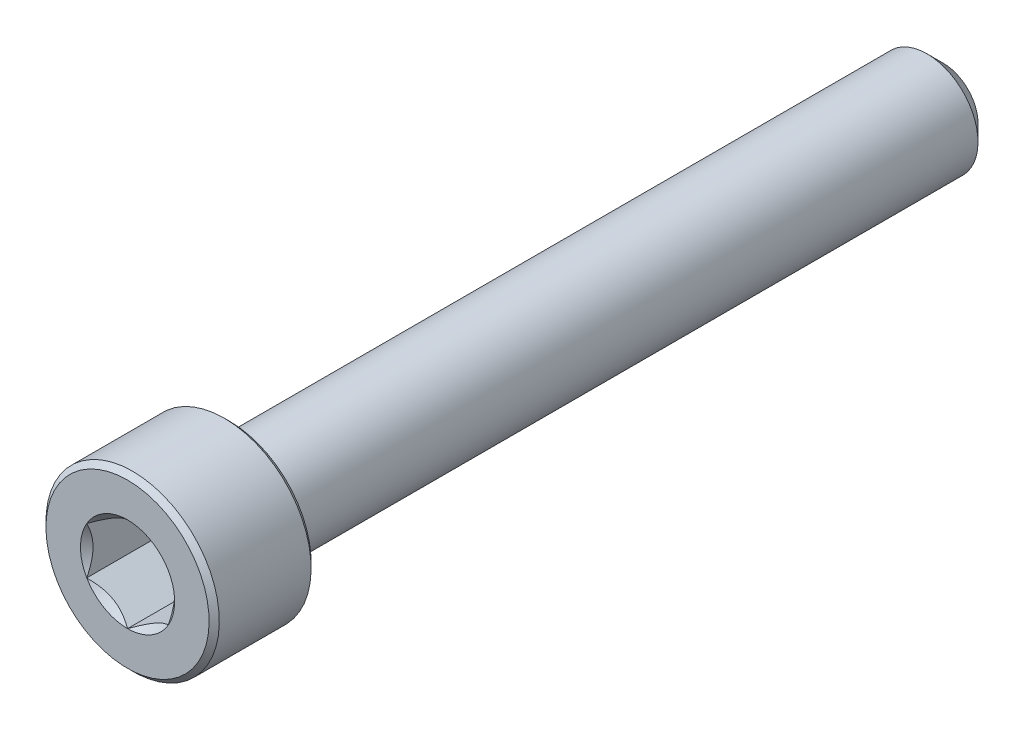
ISO-10303-21;
HEADER;
FILE_DESCRIPTION(('STEP AP214'),'2;1');
FILE_NAME('part.step','',(''),(''),'','','');
FILE_SCHEMA(('AUTOMOTIVE_DESIGN { 1 0 10303 214 1 1 1 1 }'));
ENDSEC;
DATA;
#1=APPLICATION_CONTEXT('core data for automotive mechanical design processes');
#2=APPLICATION_PROTOCOL_DEFINITION('international standard','automotive_design',2000,#1);
#3=PRODUCT_CONTEXT('',#1,'mechanical');
#4=PRODUCT('Part','Part','',(#3));
#5=PRODUCT_RELATED_PRODUCT_CATEGORY('part','',(#4));
#6=PRODUCT_DEFINITION_FORMATION('','',#4);
#7=PRODUCT_DEFINITION_CONTEXT('part definition',#1,'design');
#8=PRODUCT_DEFINITION('design','',#6,#7);
#9=PRODUCT_DEFINITION_SHAPE('','',#8);
#10=(LENGTH_UNIT() NAMED_UNIT(*) SI_UNIT(.MILLI.,.METRE.));
#11=(NAMED_UNIT(*) PLANE_ANGLE_UNIT() SI_UNIT($,.RADIAN.));
#12=(NAMED_UNIT(*) SI_UNIT($,.STERADIAN.) SOLID_ANGLE_UNIT());
#13=UNCERTAINTY_MEASURE_WITH_UNIT(LENGTH_MEASURE(1.E-05),#10,'distance_accuracy_value','');
#14=(GEOMETRIC_REPRESENTATION_CONTEXT(3) GLOBAL_UNCERTAINTY_ASSIGNED_CONTEXT((#13)) GLOBAL_UNIT_ASSIGNED_CONTEXT((#10,
#11,#12)) REPRESENTATION_CONTEXT('',''));
#15=CARTESIAN_POINT('',(0.,0.,0.));
#16=DIRECTION('',(0.,0.,1.));
#17=DIRECTION('',(1.,0.,0.));
#18=AXIS2_PLACEMENT_3D('',#15,#16,#17);
#19=CARTESIAN_POINT('',(0.,0.,20.));
#20=DIRECTION('',(0.,0.,1.));
#21=DIRECTION('',(0.,-1.,0.));
#22=AXIS2_PLACEMENT_3D('',#19,#20,#21);
#23=PLANE('',#22);
#24=CARTESIAN_POINT('',(0.,0.,20.));
#25=DIRECTION('',(0.,0.,1.));
#26=DIRECTION('',(1.,0.,0.));
#27=AXIS2_PLACEMENT_3D('',#24,#25,#26);
#28=CIRCLE('',#27,2.3094010767585);
#29=CARTESIAN_POINT('',(0.,-2.3094010767585,20.));
#30=VERTEX_POINT('',#29);
#31=CARTESIAN_POINT('',(2.,-1.15470053837925,20.));
#32=VERTEX_POINT('',#31);
#33=EDGE_CURVE('E101',#30,#32,#28,.T.);
#34=ORIENTED_EDGE('',*,*,#33,.F.);
#35=CARTESIAN_POINT('',(-2.,-1.15470053837925,20.));
#36=VERTEX_POINT('',#35);
#37=EDGE_CURVE('E271',#36,#30,#28,.T.);
#38=ORIENTED_EDGE('',*,*,#37,.F.);
#39=CARTESIAN_POINT('',(-2.,1.15470053837925,20.));
#40=VERTEX_POINT('',#39);
#41=EDGE_CURVE('E136',#40,#36,#28,.T.);
#42=ORIENTED_EDGE('',*,*,#41,.F.);
#43=CARTESIAN_POINT('',(0.,2.3094010767585,20.));
#44=VERTEX_POINT('',#43);
#45=EDGE_CURVE('E132',#44,#40,#28,.T.);
#46=ORIENTED_EDGE('',*,*,#45,.F.);
#47=CARTESIAN_POINT('',(2.,1.15470053837925,20.));
#48=VERTEX_POINT('',#47);
#49=EDGE_CURVE('E103',#48,#44,#28,.T.);
#50=ORIENTED_EDGE('',*,*,#49,.F.);
#51=EDGE_CURVE('E95',#32,#48,#28,.T.);
#52=ORIENTED_EDGE('',*,*,#51,.F.);
#53=EDGE_LOOP('',(#34,#38,#42,#46,#50,#52));
#54=FACE_BOUND('',#53,.T.);
#55=CARTESIAN_POINT('',(0.,0.,20.));
#56=DIRECTION('',(0.,0.,-1.));
#57=DIRECTION('',(0.,1.,0.));
#58=AXIS2_PLACEMENT_3D('',#55,#56,#57);
#59=CIRCLE('',#58,4.);
#60=CARTESIAN_POINT('',(0.,4.,20.));
#61=VERTEX_POINT('',#60);
#62=EDGE_CURVE('E51',#61,#61,#59,.T.);
#63=ORIENTED_EDGE('',*,*,#62,.F.);
#64=EDGE_LOOP('',(#63));
#65=FACE_BOUND('',#64,.T.);
#66=ADVANCED_FACE('F38',(#54,#65),#23,.T.);
#67=CARTESIAN_POINT('',(0.,0.,19.75));
#68=DIRECTION('',(0.,0.,-1.));
#69=DIRECTION('',(0.,1.,0.));
#70=AXIS2_PLACEMENT_3D('',#67,#68,#69);
#71=CONICAL_SURFACE('',#70,4.25,0.785398163397448);
#72=ORIENTED_EDGE('',*,*,#62,.T.);
#73=EDGE_LOOP('',(#72));
#74=FACE_BOUND('',#73,.T.);
#75=CARTESIAN_POINT('',(0.,0.,19.75));
#76=DIRECTION('',(0.,0.,-1.));
#77=DIRECTION('',(0.,1.,0.));
#78=AXIS2_PLACEMENT_3D('',#75,#76,#77);
#79=CIRCLE('',#78,4.25);
#80=CARTESIAN_POINT('',(0.,4.25,19.75));
#81=VERTEX_POINT('',#80);
#82=EDGE_CURVE('E222',#81,#81,#79,.T.);
#83=ORIENTED_EDGE('',*,*,#82,.F.);
#84=EDGE_LOOP('',(#83));
#85=FACE_BOUND('',#84,.T.);
#86=ADVANCED_FACE('F210',(#74,#85),#71,.T.);
#87=CARTESIAN_POINT('',(0.,0.,-20.));
#88=DIRECTION('',(0.,0.,-1.));
#89=DIRECTION('',(0.,1.,0.));
#90=AXIS2_PLACEMENT_3D('',#87,#88,#89);
#91=CYLINDRICAL_SURFACE('',#90,4.25);
#92=ORIENTED_EDGE('',*,*,#82,.T.);
#93=EDGE_LOOP('',(#92));
#94=FACE_BOUND('',#93,.T.);
#95=CARTESIAN_POINT('',(0.,0.,15.25));
#96=DIRECTION('',(0.,0.,-1.));
#97=DIRECTION('',(0.,1.,0.));
#98=AXIS2_PLACEMENT_3D('',#95,#96,#97);
#99=CIRCLE('',#98,4.25);
#100=CARTESIAN_POINT('',(0.,4.25,15.25));
#101=VERTEX_POINT('',#100);
#102=EDGE_CURVE('E223',#101,#101,#99,.T.);
#103=ORIENTED_EDGE('',*,*,#102,.F.);
#104=EDGE_LOOP('',(#103));
#105=FACE_BOUND('',#104,.T.);
#106=ADVANCED_FACE('F207',(#94,#105),#91,.T.);
#107=CARTESIAN_POINT('',(0.,0.,15.));
#108=DIRECTION('',(0.,0.,1.));
#109=DIRECTION('',(0.,-1.,0.));
#110=AXIS2_PLACEMENT_3D('',#107,#108,#109);
#111=CONICAL_SURFACE('',#110,4.,0.785398163397448);
#112=ORIENTED_EDGE('',*,*,#102,.T.);
#113=EDGE_LOOP('',(#112));
#114=FACE_BOUND('',#113,.T.);
#115=CARTESIAN_POINT('',(0.,0.,15.));
#116=DIRECTION('',(0.,0.,-1.));
#117=DIRECTION('',(0.,1.,0.));
#118=AXIS2_PLACEMENT_3D('',#115,#116,#117);
#119=CIRCLE('',#118,4.);
#120=CARTESIAN_POINT('',(0.,4.,15.));
#121=VERTEX_POINT('',#120);
#122=EDGE_CURVE('E226',#121,#121,#119,.T.);
#123=ORIENTED_EDGE('',*,*,#122,.F.);
#124=EDGE_LOOP('',(#123));
#125=FACE_BOUND('',#124,.T.);
#126=ADVANCED_FACE('F203',(#114,#125),#111,.T.);
#127=CARTESIAN_POINT('',(0.,4.,15.));
#128=DIRECTION('',(0.,0.,-1.));
#129=DIRECTION('',(0.,1.,0.));
#130=AXIS2_PLACEMENT_3D('',#127,#128,#129);
#131=PLANE('',#130);
#132=ORIENTED_EDGE('',*,*,#122,.T.);
#133=EDGE_LOOP('',(#132));
#134=FACE_BOUND('',#133,.T.);
#135=CARTESIAN_POINT('',(0.,0.,15.));
#136=DIRECTION('',(0.,0.,-1.));
#137=DIRECTION('',(0.,1.,0.));
#138=AXIS2_PLACEMENT_3D('',#135,#136,#137);
#139=CIRCLE('',#138,2.5);
#140=CARTESIAN_POINT('',(0.,2.5,15.));
#141=VERTEX_POINT('',#140);
#142=EDGE_CURVE('E231',#141,#141,#139,.T.);
#143=ORIENTED_EDGE('',*,*,#142,.F.);
#144=EDGE_LOOP('',(#143));
#145=FACE_BOUND('',#144,.T.);
#146=ADVANCED_FACE('F199',(#134,#145),#131,.T.);
#147=CARTESIAN_POINT('',(0.,0.,-20.));
#148=DIRECTION('',(0.,0.,-1.));
#149=DIRECTION('',(0.,1.,0.));
#150=AXIS2_PLACEMENT_3D('',#147,#148,#149);
#151=CYLINDRICAL_SURFACE('',#150,2.5);
#152=ORIENTED_EDGE('',*,*,#142,.T.);
#153=EDGE_LOOP('',(#152));
#154=FACE_BOUND('',#153,.T.);
#155=CARTESIAN_POINT('',(0.,0.,-19.2));
#156=DIRECTION('',(0.,0.,-1.));
#157=DIRECTION('',(0.,1.,0.));
#158=AXIS2_PLACEMENT_3D('',#155,#156,#157);
#159=CIRCLE('',#158,2.5);
#160=CARTESIAN_POINT('',(0.,2.5,-19.2));
#161=VERTEX_POINT('',#160);
#162=EDGE_CURVE('E234',#161,#161,#159,.T.);
#163=ORIENTED_EDGE('',*,*,#162,.F.);
#164=EDGE_LOOP('',(#163));
#165=FACE_BOUND('',#164,.T.);
#166=ADVANCED_FACE('F195',(#154,#165),#151,.T.);
#167=CARTESIAN_POINT('',(0.,0.,-20.));
#168=DIRECTION('',(0.,0.,1.));
#169=DIRECTION('',(0.,-1.,0.));
#170=AXIS2_PLACEMENT_3D('',#167,#168,#169);
#171=CONICAL_SURFACE('',#170,1.7,0.78539816339744);
#172=ORIENTED_EDGE('',*,*,#162,.T.);
#173=EDGE_LOOP('',(#172));
#174=FACE_BOUND('',#173,.T.);
#175=CARTESIAN_POINT('',(0.,0.,-20.));
#176=DIRECTION('',(0.,0.,-1.));
#177=DIRECTION('',(0.,1.,0.));
#178=AXIS2_PLACEMENT_3D('',#175,#176,#177);
#179=CIRCLE('',#178,1.7);
#180=CARTESIAN_POINT('',(0.,1.7,-20.));
#181=VERTEX_POINT('',#180);
#182=EDGE_CURVE('E237',#181,#181,#179,.T.);
#183=ORIENTED_EDGE('',*,*,#182,.F.);
#184=EDGE_LOOP('',(#183));
#185=FACE_BOUND('',#184,.T.);
#186=ADVANCED_FACE('F191',(#174,#185),#171,.T.);
#187=CARTESIAN_POINT('',(0.,1.7,-20.));
#188=DIRECTION('',(0.,0.,-1.));
#189=DIRECTION('',(0.,1.,0.));
#190=AXIS2_PLACEMENT_3D('',#187,#188,#189);
#191=PLANE('',#190);
#192=ORIENTED_EDGE('',*,*,#182,.T.);
#193=EDGE_LOOP('',(#192));
#194=FACE_BOUND('',#193,.T.);
#195=ADVANCED_FACE('F188',(#194),#191,.T.);
#196=CARTESIAN_POINT('',(0.,0.,20.));
#197=DIRECTION('',(0.,0.,1.));
#198=DIRECTION('',(1.,0.,0.));
#199=AXIS2_PLACEMENT_3D('',#196,#197,#198);
#200=CONICAL_SURFACE('',#199,2.3094010767585,0.78539816339745);
#201=ORIENTED_EDGE('',*,*,#33,.T.);
#202=CARTESIAN_POINT('',(-0.000199999999997986,-2.30951654681234,20.0001154787137));
#203=CARTESIAN_POINT('',(0.0685530340307073,-2.26982196410711,19.9604530902256));
#204=CARTESIAN_POINT('',(0.138455742135513,-2.22946361676572,19.9231199822842));
#205=CARTESIAN_POINT('',(0.280995244550438,-2.1471683966763,19.8547636851361));
#206=CARTESIAN_POINT('',(0.35364559756536,-2.10522369580642,19.8237785337372));
#207=CARTESIAN_POINT('',(0.500141601053973,-2.02064418875706,19.7707002165441));
#208=CARTESIAN_POINT('',(0.573949935246295,-1.97803092714269,19.7484736271766));
#209=CARTESIAN_POINT('',(0.723191631835264,-1.89186619344273,19.7142288166751));
#210=CARTESIAN_POINT('',(0.798620433918152,-1.84831735425552,19.7021850291441));
#211=CARTESIAN_POINT('',(0.928615500671079,-1.7732646674724,19.6913185119056));
#212=CARTESIAN_POINT('',(0.983013783970108,-1.74185780396625,19.68970975361));
#213=CARTESIAN_POINT('',(1.09172145551969,-1.67909540053412,19.6924188775987));
#214=CARTESIAN_POINT('',(1.14603080592134,-1.64773988246022,19.696738837758));
#215=CARTESIAN_POINT('',(1.25413672758934,-1.5853248994842,19.7110595674099));
#216=CARTESIAN_POINT('',(1.30793265655479,-1.55426580541469,19.721066692762));
#217=CARTESIAN_POINT('',(1.41459426230557,-1.49268469862228,19.7462124302497));
#218=CARTESIAN_POINT('',(1.46746001007071,-1.46216264491917,19.7613506490422));
#219=CARTESIAN_POINT('',(1.60287973308984,-1.38397803138049,19.8062945034292));
#220=CARTESIAN_POINT('',(1.68459383484948,-1.33680037273297,19.8394888394258));
#221=CARTESIAN_POINT('',(1.8047470372578,-1.26742988897853,19.8955258231714));
#222=CARTESIAN_POINT('',(1.84434285210918,-1.24456923461531,19.9152147029469));
#223=CARTESIAN_POINT('',(1.92280095888787,-1.19927142554652,19.9563873183649));
#224=CARTESIAN_POINT('',(1.96166368359374,-1.17683402097614,19.9778699516513));
#225=CARTESIAN_POINT('',(2.0002,-1.15458506832541,20.0001154787137));
#226=B_SPLINE_CURVE_WITH_KNOTS('',3,(#202,#203,#204,#205,#206,#207,#208,#209,#210,#211,#212,
#213,#214,#215,#216,#217,#218,#219,#220,#221,#222,#223,#224,#225),.UNSPECIFIED.,.F.,.F.,(4,2,2,
2,2,2,2,2,2,2,2,4),(0.,0.266420613771063,0.534393751523387,0.798110374376912,1.06116288956936,
1.24939906803721,1.43770123566247,1.62621426093931,1.81471283831913,2.11415604834144,
2.2634717071779,2.4126962696977),.UNSPECIFIED.);
#227=EDGE_CURVE('E12',#30,#32,#226,.T.);
#228=ORIENTED_EDGE('',*,*,#227,.F.);
#229=EDGE_LOOP('',(#201,#228));
#230=FACE_BOUND('',#229,.T.);
#231=ADVANCED_FACE('F154',(#230),#200,.F.);
#232=ORIENTED_EDGE('',*,*,#37,.T.);
#233=CARTESIAN_POINT('',(-2.0002,-1.15458506832541,20.0001154787137));
#234=CARTESIAN_POINT('',(-1.93144696596929,-1.19427965103064,19.9604530902256));
#235=CARTESIAN_POINT('',(-1.86154425786449,-1.23463799837204,19.9231199822842));
#236=CARTESIAN_POINT('',(-1.71900475544956,-1.31693321846145,19.8547636851361));
#237=CARTESIAN_POINT('',(-1.64635440243464,-1.35887791933134,19.8237785337372));
#238=CARTESIAN_POINT('',(-1.49985839894603,-1.44345742638069,19.7707002165441));
#239=CARTESIAN_POINT('',(-1.4260500647537,-1.48607068799507,19.7484736271766));
#240=CARTESIAN_POINT('',(-1.27680836816473,-1.57223542169503,19.7142288166751));
#241=CARTESIAN_POINT('',(-1.20137956608185,-1.61578426088223,19.7021850291441));
#242=CARTESIAN_POINT('',(-1.07138449932892,-1.69083694766536,19.6913185119056));
#243=CARTESIAN_POINT('',(-1.01698621602989,-1.72224381117151,19.68970975361));
#244=CARTESIAN_POINT('',(-0.908278544480305,-1.78500621460364,19.6924188775987));
#245=CARTESIAN_POINT('',(-0.853969194078659,-1.81636173267754,19.696738837758));
#246=CARTESIAN_POINT('',(-0.74586327241066,-1.87877671565355,19.7110595674099));
#247=CARTESIAN_POINT('',(-0.692067343445206,-1.90983580972306,19.721066692762));
#248=CARTESIAN_POINT('',(-0.585405737694425,-1.97141691651547,19.7462124302497));
#249=CARTESIAN_POINT('',(-0.532539989929286,-2.00193897021859,19.7613506490422));
#250=CARTESIAN_POINT('',(-0.397120266910155,-2.08012358375727,19.8062945034292));
#251=CARTESIAN_POINT('',(-0.31540616515052,-2.12730124240478,19.8394888394258));
#252=CARTESIAN_POINT('',(-0.195252962742196,-2.19667172615922,19.8955258231714));
#253=CARTESIAN_POINT('',(-0.155657147890822,-2.21953238052245,19.9152147029469));
#254=CARTESIAN_POINT('',(-0.0771990411121268,-2.26483018959124,19.9563873183649));
#255=CARTESIAN_POINT('',(-0.0383363164062587,-2.28726759416161,19.9778699516513));
#256=CARTESIAN_POINT('',(0.000200000000001381,-2.30951654681234,20.0001154787137));
#257=B_SPLINE_CURVE_WITH_KNOTS('',3,(#233,#234,#235,#236,#237,#238,#239,#240,#241,#242,#243,
#244,#245,#246,#247,#248,#249,#250,#251,#252,#253,#254,#255,#256),.UNSPECIFIED.,.F.,.F.,(4,2,2,
2,2,2,2,2,2,2,2,4),(0.,0.266420613771063,0.534393751523388,0.798110374376914,1.06116288956936,
1.24939906803722,1.43770123566248,1.62621426093932,1.81471283831913,2.11415604834145,
2.2634717071779,2.41269626969771),.UNSPECIFIED.);
#258=EDGE_CURVE('E133',#36,#30,#257,.T.);
#259=ORIENTED_EDGE('',*,*,#258,.F.);
#260=EDGE_LOOP('',(#232,#259));
#261=FACE_BOUND('',#260,.T.);
#262=ADVANCED_FACE('F269',(#261),#200,.F.);
#263=ORIENTED_EDGE('',*,*,#41,.T.);
#264=CARTESIAN_POINT('',(-2.,-2.30294417292923,20.7407713550277));
#265=CARTESIAN_POINT('',(-2.,-2.24687002663712,20.698443273626));
#266=CARTESIAN_POINT('',(-2.,-2.19048190536959,20.6565251568643));
#267=CARTESIAN_POINT('',(-2.,-2.07695390496424,20.573690417861));
#268=CARTESIAN_POINT('',(-2.,-2.01981384066454,20.5327740496681));
#269=CARTESIAN_POINT('',(-2.,-1.90424016804776,20.4518334520186));
#270=CARTESIAN_POINT('',(-2.,-1.8457999674391,20.4118185915599));
#271=CARTESIAN_POINT('',(-2.,-1.7279274546176,20.3332889936643));
#272=CARTESIAN_POINT('',(-2.,-1.66849521292324,20.2947741502431));
#273=CARTESIAN_POINT('',(-2.,-1.4816299571002,20.1776406516043));
#274=CARTESIAN_POINT('',(-2.,-1.35220318163536,20.1021459017296));
#275=CARTESIAN_POINT('',(-2.,-1.08689521592924,19.9640493509944));
#276=CARTESIAN_POINT('',(-2.,-0.951037763938192,19.9014040859035));
#277=CARTESIAN_POINT('',(-2.,-0.747111912259409,19.8247635438752));
#278=CARTESIAN_POINT('',(-2.,-0.682064034147876,19.8027671799191));
#279=CARTESIAN_POINT('',(-2.,-0.550398103294752,19.7639966876601));
#280=CARTESIAN_POINT('',(-2.,-0.483779942722476,19.7472229191212));
#281=CARTESIAN_POINT('',(-2.,-0.350484328847655,19.7200482578844));
#282=CARTESIAN_POINT('',(-2.,-0.283829489364786,19.7095381767417));
#283=CARTESIAN_POINT('',(-2.,-0.149806987139377,19.6950960855449));
#284=CARTESIAN_POINT('',(-2.,-0.0824394489341225,19.6911629447331));
#285=CARTESIAN_POINT('',(-2.,0.049905562294489,19.6901664769337));
#286=CARTESIAN_POINT('',(-2.,0.114881285143171,19.6928596448504));
#287=CARTESIAN_POINT('',(-2.,0.24427592148276,19.7044300704227));
#288=CARTESIAN_POINT('',(-2.,0.308694780266753,19.7133079288332));
#289=CARTESIAN_POINT('',(-2.,0.437599788610704,19.7369136592961));
#290=CARTESIAN_POINT('',(-2.,0.502067428644595,19.7517410834465));
#291=CARTESIAN_POINT('',(-2.,0.629594322598306,19.786457883628));
#292=CARTESIAN_POINT('',(-2.,0.69265369388315,19.8063468361063));
#293=CARTESIAN_POINT('',(-2.,0.891187889210545,19.8764469792562));
#294=CARTESIAN_POINT('',(-2.,1.02383545707306,19.9346418003215));
#295=CARTESIAN_POINT('',(-2.,1.28290932150074,20.0640305754596));
#296=CARTESIAN_POINT('',(-2.,1.4093111258757,20.1352712314148));
#297=CARTESIAN_POINT('',(-2.,1.59200441438963,20.2464419918747));
#298=CARTESIAN_POINT('',(-2.,1.65027549026191,20.2831821903374));
#299=CARTESIAN_POINT('',(-2.,1.76581760389242,20.3582145141838));
#300=CARTESIAN_POINT('',(-2.,1.82308856543104,20.396506757118));
#301=CARTESIAN_POINT('',(-2.,1.93629654762084,20.4740422640812));
#302=CARTESIAN_POINT('',(-2.,1.99224062500538,20.5132752761336));
#303=CARTESIAN_POINT('',(-2.,2.10336424029899,20.5927788307365));
#304=CARTESIAN_POINT('',(-2.,2.15854398422468,20.6330490850006));
#305=CARTESIAN_POINT('',(-2.,2.21340370692658,20.6737442381459));
#306=B_SPLINE_CURVE_WITH_KNOTS('',3,(#264,#265,#266,#267,#268,#269,#270,#271,#272,#273,#274,
#275,#276,#277,#278,#279,#280,#281,#282,#283,#284,#285,#286,#287,#288,#289,#290,#291,#292,#293,
#294,#295,#296,#297,#298,#299,#300,#301,#302,#303,#304,#305),.UNSPECIFIED.,.F.,.F.,(4,2,2,2,2,2,
2,2,2,2,2,2,2,2,2,2,2,2,2,2,4),(0.,0.21077273197689,0.421598374658589,0.63405755462349,
0.846501695870171,1.29562155455624,1.74319622821645,1.94902062110207,2.15485918928325,
2.35699582502635,2.5590977043214,2.75388435553556,2.94868993014815,3.14690093452586,
3.34509535789702,3.77838155837654,4.21325029921625,4.41989056685646,4.6265465146092,
4.83152377111289,5.03644465914085),.UNSPECIFIED.);
#307=EDGE_CURVE('E134',#40,#36,#306,.F.);
#308=ORIENTED_EDGE('',*,*,#307,.F.);
#309=EDGE_LOOP('',(#263,#308));
#310=FACE_BOUND('',#309,.T.);
#311=ADVANCED_FACE('F274',(#310),#200,.F.);
#312=ORIENTED_EDGE('',*,*,#45,.T.);
#313=CARTESIAN_POINT('',(0.000199999999999413,2.30951654681234,20.0001154787137));
#314=CARTESIAN_POINT('',(-0.0685530340307057,2.26982196410711,19.9604530902256));
#315=CARTESIAN_POINT('',(-0.138455742135512,2.22946361676572,19.9231199822842));
#316=CARTESIAN_POINT('',(-0.280995244550436,2.1471683966763,19.8547636851361));
#317=CARTESIAN_POINT('',(-0.353645597565359,2.10522369580642,19.8237785337372));
#318=CARTESIAN_POINT('',(-0.500141601053972,2.02064418875706,19.7707002165441));
#319=CARTESIAN_POINT('',(-0.573949935246295,1.97803092714269,19.7484736271766));
#320=CARTESIAN_POINT('',(-0.723191631835265,1.89186619344273,19.7142288166751));
#321=CARTESIAN_POINT('',(-0.798620433918153,1.84831735425552,19.7021850291441));
#322=CARTESIAN_POINT('',(-0.928615500671081,1.7732646674724,19.6913185119056));
#323=CARTESIAN_POINT('',(-0.98301378397011,1.74185780396625,19.68970975361));
#324=CARTESIAN_POINT('',(-1.0917214555197,1.67909540053412,19.6924188775987));
#325=CARTESIAN_POINT('',(-1.14603080592134,1.64773988246021,19.696738837758));
#326=CARTESIAN_POINT('',(-1.25413672758934,1.5853248994842,19.7110595674099));
#327=CARTESIAN_POINT('',(-1.30793265655479,1.55426580541469,19.721066692762));
#328=CARTESIAN_POINT('',(-1.41459426230558,1.49268469862228,19.7462124302497));
#329=CARTESIAN_POINT('',(-1.46746001007071,1.46216264491916,19.7613506490422));
#330=CARTESIAN_POINT('',(-1.60287973308985,1.38397803138048,19.8062945034292));
#331=CARTESIAN_POINT('',(-1.68459383484948,1.33680037273297,19.8394888394258));
#332=CARTESIAN_POINT('',(-1.8047470372578,1.26742988897853,19.8955258231714));
#333=CARTESIAN_POINT('',(-1.84434285210918,1.24456923461531,19.9152147029469));
#334=CARTESIAN_POINT('',(-1.92280095888787,1.19927142554652,19.9563873183649));
#335=CARTESIAN_POINT('',(-1.96166368359374,1.17683402097614,19.9778699516513));
#336=CARTESIAN_POINT('',(-2.0002,1.15458506832541,20.0001154787137));
#337=B_SPLINE_CURVE_WITH_KNOTS('',3,(#313,#314,#315,#316,#317,#318,#319,#320,#321,#322,#323,
#324,#325,#326,#327,#328,#329,#330,#331,#332,#333,#334,#335,#336),.UNSPECIFIED.,.F.,.F.,(4,2,2,
2,2,2,2,2,2,2,2,4),(0.,0.266420613771063,0.534393751523387,0.798110374376913,1.06116288956936,
1.24939906803722,1.43770123566247,1.62621426093932,1.81471283831913,2.11415604834145,
2.2634717071779,2.41269626969771),.UNSPECIFIED.);
#338=EDGE_CURVE('E113',#44,#40,#337,.T.);
#339=ORIENTED_EDGE('',*,*,#338,.F.);
#340=EDGE_LOOP('',(#312,#339));
#341=FACE_BOUND('',#340,.T.);
#342=ADVANCED_FACE('F308',(#341),#200,.F.);
#343=ORIENTED_EDGE('',*,*,#49,.T.);
#344=CARTESIAN_POINT('',(2.0002,1.15458506832541,20.0001154787137));
#345=CARTESIAN_POINT('',(1.9314469659693,1.19427965103064,19.9604530902256));
#346=CARTESIAN_POINT('',(1.86154425786449,1.23463799837204,19.9231199822842));
#347=CARTESIAN_POINT('',(1.71900475544956,1.31693321846145,19.8547636851361));
#348=CARTESIAN_POINT('',(1.64635440243464,1.35887791933134,19.8237785337372));
#349=CARTESIAN_POINT('',(1.49985839894603,1.44345742638069,19.7707002165441));
#350=CARTESIAN_POINT('',(1.4260500647537,1.48607068799507,19.7484736271766));
#351=CARTESIAN_POINT('',(1.27680836816473,1.57223542169503,19.7142288166751));
#352=CARTESIAN_POINT('',(1.20137956608185,1.61578426088223,19.7021850291441));
#353=CARTESIAN_POINT('',(1.07138449932892,1.69083694766536,19.6913185119056));
#354=CARTESIAN_POINT('',(1.01698621602989,1.72224381117151,19.68970975361));
#355=CARTESIAN_POINT('',(0.908278544480303,1.78500621460364,19.6924188775987));
#356=CARTESIAN_POINT('',(0.853969194078657,1.81636173267754,19.696738837758));
#357=CARTESIAN_POINT('',(0.745863272410658,1.87877671565355,19.7110595674099));
#358=CARTESIAN_POINT('',(0.692067343445204,1.90983580972307,19.721066692762));
#359=CARTESIAN_POINT('',(0.585405737694423,1.97141691651548,19.7462124302497));
#360=CARTESIAN_POINT('',(0.532539989929284,2.00193897021859,19.7613506490422));
#361=CARTESIAN_POINT('',(0.397120266910153,2.08012358375727,19.8062945034292));
#362=CARTESIAN_POINT('',(0.315406165150519,2.12730124240478,19.8394888394258));
#363=CARTESIAN_POINT('',(0.195252962742196,2.19667172615922,19.8955258231714));
#364=CARTESIAN_POINT('',(0.155657147890822,2.21953238052245,19.9152147029469));
#365=CARTESIAN_POINT('',(0.0771990411121279,2.26483018959124,19.9563873183649));
#366=CARTESIAN_POINT('',(0.0383363164062598,2.28726759416161,19.9778699516513));
#367=CARTESIAN_POINT('',(-0.000200000000000076,2.30951654681234,20.0001154787137));
#368=B_SPLINE_CURVE_WITH_KNOTS('',3,(#344,#345,#346,#347,#348,#349,#350,#351,#352,#353,#354,
#355,#356,#357,#358,#359,#360,#361,#362,#363,#364,#365,#366,#367),.UNSPECIFIED.,.F.,.F.,(4,2,2,
2,2,2,2,2,2,2,2,4),(0.,0.266420613771065,0.53439375152339,0.798110374376917,1.06116288956937,
1.24939906803722,1.43770123566248,1.62621426093932,1.81471283831914,2.11415604834145,
2.26347170717791,2.41269626969771),.UNSPECIFIED.);
#369=EDGE_CURVE('E106',#48,#44,#368,.T.);
#370=ORIENTED_EDGE('',*,*,#369,.F.);
#371=EDGE_LOOP('',(#343,#370));
#372=FACE_BOUND('',#371,.T.);
#373=ADVANCED_FACE('F107',(#372),#200,.F.);
#374=ORIENTED_EDGE('',*,*,#51,.T.);
#375=CARTESIAN_POINT('',(2.,-2.30294417292923,20.7407713550277));
#376=CARTESIAN_POINT('',(2.,-2.24687002663712,20.698443273626));
#377=CARTESIAN_POINT('',(2.,-2.19048190536959,20.6565251568643));
#378=CARTESIAN_POINT('',(2.,-2.07695390496424,20.573690417861));
#379=CARTESIAN_POINT('',(2.,-2.01981384066454,20.5327740496681));
#380=CARTESIAN_POINT('',(2.,-1.90424016804776,20.4518334520186));
#381=CARTESIAN_POINT('',(2.,-1.8457999674391,20.4118185915599));
#382=CARTESIAN_POINT('',(2.,-1.7279274546176,20.3332889936643));
#383=CARTESIAN_POINT('',(2.,-1.66849521292324,20.2947741502431));
#384=CARTESIAN_POINT('',(2.,-1.4816299571002,20.1776406516043));
#385=CARTESIAN_POINT('',(2.,-1.35220318163536,20.1021459017296));
#386=CARTESIAN_POINT('',(2.,-1.08689521592925,19.9640493509944));
#387=CARTESIAN_POINT('',(2.,-0.951037763938192,19.9014040859035));
#388=CARTESIAN_POINT('',(2.,-0.747111912259408,19.8247635438752));
#389=CARTESIAN_POINT('',(2.,-0.682064034147875,19.8027671799191));
#390=CARTESIAN_POINT('',(2.,-0.550398103294752,19.7639966876601));
#391=CARTESIAN_POINT('',(2.,-0.483779942722476,19.7472229191212));
#392=CARTESIAN_POINT('',(2.,-0.350484328847655,19.7200482578844));
#393=CARTESIAN_POINT('',(2.,-0.283829489364786,19.7095381767417));
#394=CARTESIAN_POINT('',(2.,-0.149806987139378,19.6950960855449));
#395=CARTESIAN_POINT('',(2.,-0.0824394489341232,19.6911629447331));
#396=CARTESIAN_POINT('',(2.,0.0499055622944886,19.6901664769337));
#397=CARTESIAN_POINT('',(2.,0.114881285143171,19.6928596448504));
#398=CARTESIAN_POINT('',(2.,0.24427592148276,19.7044300704227));
#399=CARTESIAN_POINT('',(2.,0.308694780266752,19.7133079288332));
#400=CARTESIAN_POINT('',(2.,0.437599788610704,19.7369136592961));
#401=CARTESIAN_POINT('',(2.,0.502067428644594,19.7517410834465));
#402=CARTESIAN_POINT('',(2.,0.629594322598305,19.786457883628));
#403=CARTESIAN_POINT('',(2.,0.692653693883149,19.8063468361063));
#404=CARTESIAN_POINT('',(2.,0.891187889210544,19.8764469792562));
#405=CARTESIAN_POINT('',(2.,1.02383545707306,19.9346418003215));
#406=CARTESIAN_POINT('',(2.,1.28290932150074,20.0640305754596));
#407=CARTESIAN_POINT('',(2.,1.4093111258757,20.1352712314148));
#408=CARTESIAN_POINT('',(2.,1.59200441438963,20.2464419918747));
#409=CARTESIAN_POINT('',(2.,1.65027549026191,20.2831821903374));
#410=CARTESIAN_POINT('',(2.,1.76581760389242,20.3582145141838));
#411=CARTESIAN_POINT('',(2.,1.82308856543104,20.396506757118));
#412=CARTESIAN_POINT('',(2.,1.93629654762083,20.4740422640812));
#413=CARTESIAN_POINT('',(2.,1.99224062500538,20.5132752761336));
#414=CARTESIAN_POINT('',(2.,2.10336424029899,20.5927788307365));
#415=CARTESIAN_POINT('',(2.,2.15854398422468,20.6330490850006));
#416=CARTESIAN_POINT('',(2.,2.21340370692658,20.6737442381459));
#417=B_SPLINE_CURVE_WITH_KNOTS('',3,(#375,#376,#377,#378,#379,#380,#381,#382,#383,#384,#385,
#386,#387,#388,#389,#390,#391,#392,#393,#394,#395,#396,#397,#398,#399,#400,#401,#402,#403,#404,
#405,#406,#407,#408,#409,#410,#411,#412,#413,#414,#415,#416),.UNSPECIFIED.,.F.,.F.,(4,2,2,2,2,2,
2,2,2,2,2,2,2,2,2,2,2,2,2,2,4),(0.,0.210772731976891,0.421598374658588,0.634057554623487,
0.846501695870171,1.29562155455624,1.74319622821645,1.94902062110208,2.15485918928326,
2.35699582502635,2.5590977043214,2.75388435553556,2.94868993014815,3.14690093452586,
3.34509535789702,3.77838155837654,4.21325029921625,4.41989056685647,4.6265465146092,
4.83152377111289,5.03644465914085),.UNSPECIFIED.);
#418=EDGE_CURVE('E57',#32,#48,#417,.T.);
#419=ORIENTED_EDGE('',*,*,#418,.F.);
#420=EDGE_LOOP('',(#374,#419));
#421=FACE_BOUND('',#420,.T.);
#422=ADVANCED_FACE('F97',(#421),#200,.F.);
#423=CARTESIAN_POINT('',(0.,4.,16.));
#424=DIRECTION('',(0.,0.,-1.));
#425=DIRECTION('',(0.,1.,0.));
#426=AXIS2_PLACEMENT_3D('',#423,#424,#425);
#427=PLANE('',#426);
#428=DIRECTION('',(0.866025403784439,0.5,0.));
#429=VECTOR('',#428,1.);
#430=CARTESIAN_POINT('',(0.,-2.3094010767585,16.));
#431=LINE('',#430,#429);
#432=CARTESIAN_POINT('',(0.,-2.3094010767585,16.));
#433=VERTEX_POINT('',#432);
#434=CARTESIAN_POINT('',(2.,-1.15470053837925,16.));
#435=VERTEX_POINT('',#434);
#436=EDGE_CURVE('E240',#433,#435,#431,.T.);
#437=ORIENTED_EDGE('',*,*,#436,.T.);
#438=DIRECTION('',(0.,1.,0.));
#439=VECTOR('',#438,1.);
#440=CARTESIAN_POINT('',(2.,-1.15470053837925,16.));
#441=LINE('',#440,#439);
#442=CARTESIAN_POINT('',(2.,1.15470053837925,16.));
#443=VERTEX_POINT('',#442);
#444=EDGE_CURVE('E123',#435,#443,#441,.T.);
#445=ORIENTED_EDGE('',*,*,#444,.T.);
#446=DIRECTION('',(-0.866025403784439,0.5,0.));
#447=VECTOR('',#446,1.);
#448=CARTESIAN_POINT('',(2.,1.15470053837925,16.));
#449=LINE('',#448,#447);
#450=CARTESIAN_POINT('',(0.,2.3094010767585,16.));
#451=VERTEX_POINT('',#450);
#452=EDGE_CURVE('E127',#443,#451,#449,.T.);
#453=ORIENTED_EDGE('',*,*,#452,.T.);
#454=DIRECTION('',(-0.866025403784439,-0.5,0.));
#455=VECTOR('',#454,1.);
#456=CARTESIAN_POINT('',(0.,2.3094010767585,16.));
#457=LINE('',#456,#455);
#458=CARTESIAN_POINT('',(-2.,1.15470053837925,16.));
#459=VERTEX_POINT('',#458);
#460=EDGE_CURVE('E244',#451,#459,#457,.T.);
#461=ORIENTED_EDGE('',*,*,#460,.T.);
#462=DIRECTION('',(0.,-1.,0.));
#463=VECTOR('',#462,1.);
#464=CARTESIAN_POINT('',(-2.,1.15470053837925,16.));
#465=LINE('',#464,#463);
#466=CARTESIAN_POINT('',(-2.,-1.15470053837925,16.));
#467=VERTEX_POINT('',#466);
#468=EDGE_CURVE('E248',#459,#467,#465,.T.);
#469=ORIENTED_EDGE('',*,*,#468,.T.);
#470=DIRECTION('',(0.866025403784439,-0.5,0.));
#471=VECTOR('',#470,1.);
#472=CARTESIAN_POINT('',(-2.,-1.15470053837925,16.));
#473=LINE('',#472,#471);
#474=EDGE_CURVE('E250',#467,#433,#473,.T.);
#475=ORIENTED_EDGE('',*,*,#474,.T.);
#476=EDGE_LOOP('',(#437,#445,#453,#461,#469,#475));
#477=FACE_BOUND('',#476,.T.);
#478=ADVANCED_FACE('F153',(#477),#427,.F.);
#479=CARTESIAN_POINT('',(0.,-2.3094010767585,8.88989907339221));
#480=DIRECTION('',(0.5,-0.866025403784438,0.));
#481=DIRECTION('',(0.866025403784439,0.5,0.));
#482=AXIS2_PLACEMENT_3D('',#479,#480,#481);
#483=PLANE('',#482);
#484=DIRECTION('',(0.,0.,1.));
#485=VECTOR('',#484,1.);
#486=CARTESIAN_POINT('',(0.,-2.3094010767585,8.88989907339221));
#487=LINE('',#486,#485);
#488=EDGE_CURVE('E251',#433,#30,#487,.T.);
#489=ORIENTED_EDGE('',*,*,#488,.T.);
#490=ORIENTED_EDGE('',*,*,#227,.T.);
#491=DIRECTION('',(0.,0.,1.));
#492=VECTOR('',#491,1.);
#493=CARTESIAN_POINT('',(2.,-1.15470053837925,8.88989907339221));
#494=LINE('',#493,#492);
#495=EDGE_CURVE('E122',#435,#32,#494,.T.);
#496=ORIENTED_EDGE('',*,*,#495,.F.);
#497=ORIENTED_EDGE('',*,*,#436,.F.);
#498=EDGE_LOOP('',(#489,#490,#496,#497));
#499=FACE_BOUND('',#498,.T.);
#500=ADVANCED_FACE('F155',(#499),#483,.F.);
#501=CARTESIAN_POINT('',(-2.,-1.15470053837925,8.88989907339221));
#502=DIRECTION('',(-0.5,-0.866025403784438,0.));
#503=DIRECTION('',(0.866025403784439,-0.5,0.));
#504=AXIS2_PLACEMENT_3D('',#501,#502,#503);
#505=PLANE('',#504);
#506=DIRECTION('',(0.,0.,1.));
#507=VECTOR('',#506,1.);
#508=CARTESIAN_POINT('',(-2.,-1.15470053837925,8.88989907339221));
#509=LINE('',#508,#507);
#510=EDGE_CURVE('E65',#467,#36,#509,.T.);
#511=ORIENTED_EDGE('',*,*,#510,.T.);
#512=ORIENTED_EDGE('',*,*,#258,.T.);
#513=ORIENTED_EDGE('',*,*,#488,.F.);
#514=ORIENTED_EDGE('',*,*,#474,.F.);
#515=EDGE_LOOP('',(#511,#512,#513,#514));
#516=FACE_BOUND('',#515,.T.);
#517=ADVANCED_FACE('F149',(#516),#505,.F.);
#518=CARTESIAN_POINT('',(-2.,1.15470053837925,8.88989907339221));
#519=DIRECTION('',(-1.,0.,0.));
#520=DIRECTION('',(0.,-1.,0.));
#521=AXIS2_PLACEMENT_3D('',#518,#519,#520);
#522=PLANE('',#521);
#523=DIRECTION('',(0.,0.,1.));
#524=VECTOR('',#523,1.);
#525=CARTESIAN_POINT('',(-2.,1.15470053837925,8.88989907339221));
#526=LINE('',#525,#524);
#527=EDGE_CURVE('E245',#459,#40,#526,.T.);
#528=ORIENTED_EDGE('',*,*,#527,.T.);
#529=ORIENTED_EDGE('',*,*,#307,.T.);
#530=ORIENTED_EDGE('',*,*,#510,.F.);
#531=ORIENTED_EDGE('',*,*,#468,.F.);
#532=EDGE_LOOP('',(#528,#529,#530,#531));
#533=FACE_BOUND('',#532,.T.);
#534=ADVANCED_FACE('F280',(#533),#522,.F.);
#535=CARTESIAN_POINT('',(0.,2.3094010767585,8.88989907339221));
#536=DIRECTION('',(-0.5,0.866025403784438,0.));
#537=DIRECTION('',(-0.866025403784439,-0.5,0.));
#538=AXIS2_PLACEMENT_3D('',#535,#536,#537);
#539=PLANE('',#538);
#540=DIRECTION('',(0.,0.,1.));
#541=VECTOR('',#540,1.);
#542=CARTESIAN_POINT('',(0.,2.3094010767585,8.88989907339221));
#543=LINE('',#542,#541);
#544=EDGE_CURVE('E242',#451,#44,#543,.T.);
#545=ORIENTED_EDGE('',*,*,#544,.T.);
#546=ORIENTED_EDGE('',*,*,#338,.T.);
#547=ORIENTED_EDGE('',*,*,#527,.F.);
#548=ORIENTED_EDGE('',*,*,#460,.F.);
#549=EDGE_LOOP('',(#545,#546,#547,#548));
#550=FACE_BOUND('',#549,.T.);
#551=ADVANCED_FACE('F180',(#550),#539,.F.);
#552=CARTESIAN_POINT('',(2.,1.15470053837925,8.88989907339221));
#553=DIRECTION('',(0.5,0.866025403784439,0.));
#554=DIRECTION('',(-0.866025403784439,0.5,0.));
#555=AXIS2_PLACEMENT_3D('',#552,#553,#554);
#556=PLANE('',#555);
#557=DIRECTION('',(0.,0.,1.));
#558=VECTOR('',#557,1.);
#559=CARTESIAN_POINT('',(2.,1.15470053837925,8.88989907339221));
#560=LINE('',#559,#558);
#561=EDGE_CURVE('E119',#443,#48,#560,.T.);
#562=ORIENTED_EDGE('',*,*,#561,.T.);
#563=ORIENTED_EDGE('',*,*,#369,.T.);
#564=ORIENTED_EDGE('',*,*,#544,.F.);
#565=ORIENTED_EDGE('',*,*,#452,.F.);
#566=EDGE_LOOP('',(#562,#563,#564,#565));
#567=FACE_BOUND('',#566,.T.);
#568=ADVANCED_FACE('F125',(#567),#556,.F.);
#569=CARTESIAN_POINT('',(2.,-1.15470053837925,8.88989907339221));
#570=DIRECTION('',(1.,0.,0.));
#571=DIRECTION('',(0.,0.,-1.));
#572=AXIS2_PLACEMENT_3D('',#569,#570,#571);
#573=PLANE('',#572);
#574=ORIENTED_EDGE('',*,*,#495,.T.);
#575=ORIENTED_EDGE('',*,*,#418,.T.);
#576=ORIENTED_EDGE('',*,*,#561,.F.);
#577=ORIENTED_EDGE('',*,*,#444,.F.);
#578=EDGE_LOOP('',(#574,#575,#576,#577));
#579=FACE_BOUND('',#578,.T.);
#580=ADVANCED_FACE('F118',(#579),#573,.F.);
#581=CLOSED_SHELL('',(#66,#86,#106,#126,#146,#166,#186,#195,#231,#262,#311,#342,#373,#422,#478,
#500,#517,#534,#551,#568,#580));
#582=MANIFOLD_SOLID_BREP('B2',#581);
#583=ADVANCED_BREP_SHAPE_REPRESENTATION('',(#18,#582),#14);
#584=SHAPE_DEFINITION_REPRESENTATION(#9,#583);
ENDSEC;
END-ISO-10303-21;
